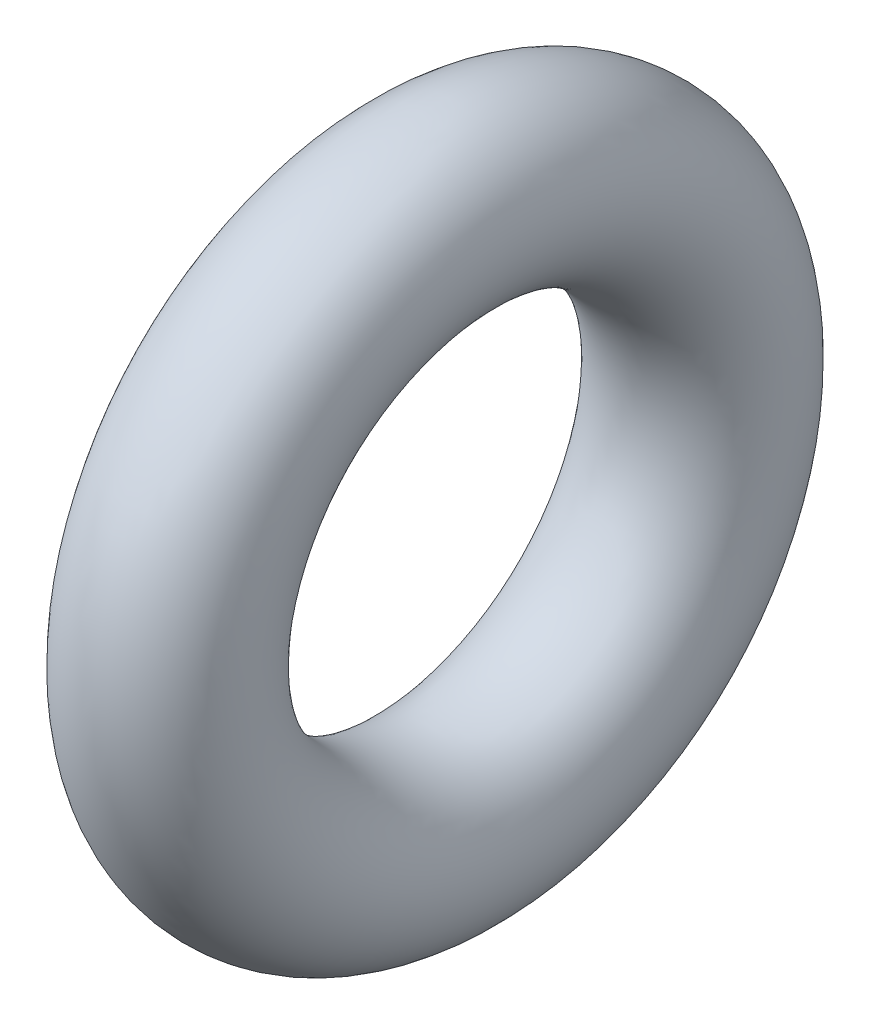
ISO-10303-21;
HEADER;
FILE_DESCRIPTION(('STEP AP214'),'2;1');
FILE_NAME('part.step','',(''),(''),'','','');
FILE_SCHEMA(('AUTOMOTIVE_DESIGN { 1 0 10303 214 1 1 1 1 }'));
ENDSEC;
DATA;
#1=APPLICATION_CONTEXT('core data for automotive mechanical design processes');
#2=APPLICATION_PROTOCOL_DEFINITION('international standard','automotive_design',2000,#1);
#3=PRODUCT_CONTEXT('',#1,'mechanical');
#4=PRODUCT('Part','Part','',(#3));
#5=PRODUCT_RELATED_PRODUCT_CATEGORY('part','',(#4));
#6=PRODUCT_DEFINITION_FORMATION('','',#4);
#7=PRODUCT_DEFINITION_CONTEXT('part definition',#1,'design');
#8=PRODUCT_DEFINITION('design','',#6,#7);
#9=PRODUCT_DEFINITION_SHAPE('','',#8);
#10=(LENGTH_UNIT() NAMED_UNIT(*) SI_UNIT(.MILLI.,.METRE.));
#11=(NAMED_UNIT(*) PLANE_ANGLE_UNIT() SI_UNIT($,.RADIAN.));
#12=(NAMED_UNIT(*) SI_UNIT($,.STERADIAN.) SOLID_ANGLE_UNIT());
#13=UNCERTAINTY_MEASURE_WITH_UNIT(LENGTH_MEASURE(1.E-05),#10,'distance_accuracy_value','');
#14=(GEOMETRIC_REPRESENTATION_CONTEXT(3) GLOBAL_UNCERTAINTY_ASSIGNED_CONTEXT((#13)) GLOBAL_UNIT_ASSIGNED_CONTEXT((#10,
#11,#12)) REPRESENTATION_CONTEXT('',''));
#15=CARTESIAN_POINT('',(0.,0.,0.));
#16=DIRECTION('',(0.,0.,1.));
#17=DIRECTION('',(1.,0.,0.));
#18=AXIS2_PLACEMENT_3D('',#15,#16,#17);
#19=CARTESIAN_POINT('',(0.,0.,0.));
#20=DIRECTION('',(-1.,0.,0.));
#21=DIRECTION('',(0.,0.,1.));
#22=AXIS2_PLACEMENT_3D('',#19,#20,#21);
#23=TOROIDAL_SURFACE('',#22,21.9,7.);
#24=CARTESIAN_POINT('',(0.,0.,28.9));
#25=VERTEX_POINT('',#24);
#26=VERTEX_LOOP('',#25);
#27=FACE_BOUND('',#26,.T.);
#28=ADVANCED_FACE('F31',(#27),#23,.T.);
#29=CLOSED_SHELL('',(#28));
#30=MANIFOLD_SOLID_BREP('B2',#29);
#31=ADVANCED_BREP_SHAPE_REPRESENTATION('',(#18,#30),#14);
#32=SHAPE_DEFINITION_REPRESENTATION(#9,#31);
ENDSEC;
END-ISO-10303-21;
